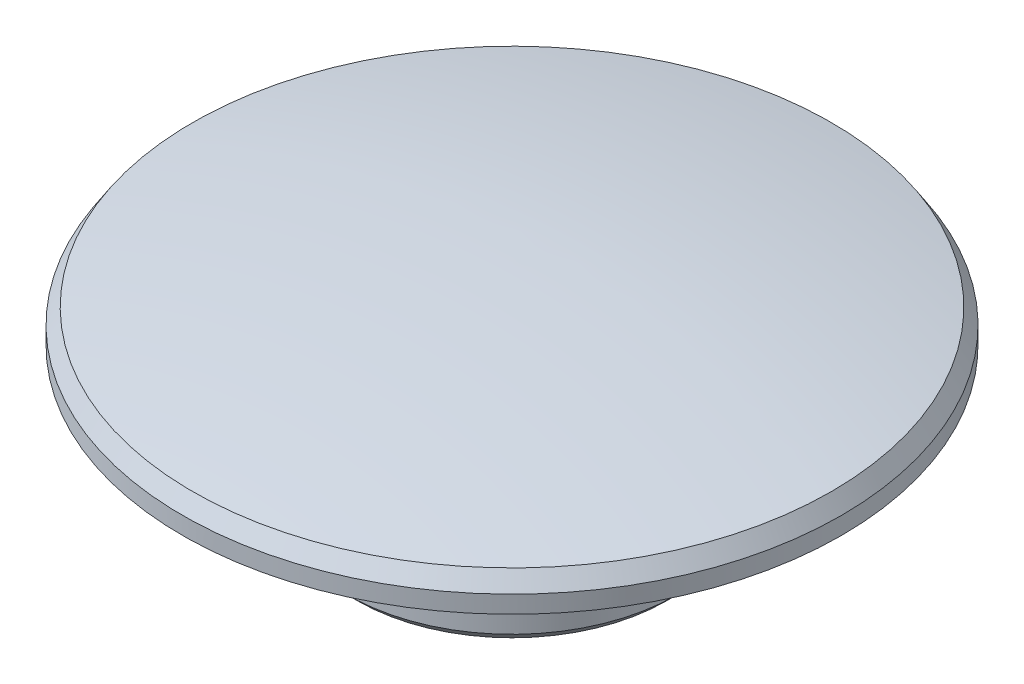
ISO-10303-21;
HEADER;
FILE_DESCRIPTION(('STEP AP214'),'2;1');
FILE_NAME('part.step','',(''),(''),'','','');
FILE_SCHEMA(('AUTOMOTIVE_DESIGN { 1 0 10303 214 1 1 1 1 }'));
ENDSEC;
DATA;
#1=APPLICATION_CONTEXT('core data for automotive mechanical design processes');
#2=APPLICATION_PROTOCOL_DEFINITION('international standard','automotive_design',2000,#1);
#3=PRODUCT_CONTEXT('',#1,'mechanical');
#4=PRODUCT('Part','Part','',(#3));
#5=PRODUCT_RELATED_PRODUCT_CATEGORY('part','',(#4));
#6=PRODUCT_DEFINITION_FORMATION('','',#4);
#7=PRODUCT_DEFINITION_CONTEXT('part definition',#1,'design');
#8=PRODUCT_DEFINITION('design','',#6,#7);
#9=PRODUCT_DEFINITION_SHAPE('','',#8);
#10=(LENGTH_UNIT() NAMED_UNIT(*) SI_UNIT(.MILLI.,.METRE.));
#11=(NAMED_UNIT(*) PLANE_ANGLE_UNIT() SI_UNIT($,.RADIAN.));
#12=(NAMED_UNIT(*) SI_UNIT($,.STERADIAN.) SOLID_ANGLE_UNIT());
#13=UNCERTAINTY_MEASURE_WITH_UNIT(LENGTH_MEASURE(1.E-05),#10,'distance_accuracy_value','');
#14=(GEOMETRIC_REPRESENTATION_CONTEXT(3) GLOBAL_UNCERTAINTY_ASSIGNED_CONTEXT((#13)) GLOBAL_UNIT_ASSIGNED_CONTEXT((#10,
#11,#12)) REPRESENTATION_CONTEXT('',''));
#15=CARTESIAN_POINT('',(0.,0.,0.));
#16=DIRECTION('',(0.,0.,1.));
#17=DIRECTION('',(1.,0.,0.));
#18=AXIS2_PLACEMENT_3D('',#15,#16,#17);
#19=CARTESIAN_POINT('',(5.7,0.,0.));
#20=DIRECTION('',(0.,-1.,0.));
#21=DIRECTION('',(1.,0.,0.));
#22=AXIS2_PLACEMENT_3D('',#19,#20,#21);
#23=PLANE('',#22);
#24=CARTESIAN_POINT('',(0.,0.,0.));
#25=DIRECTION('',(0.,-1.,0.));
#26=DIRECTION('',(1.,0.,0.));
#27=AXIS2_PLACEMENT_3D('',#24,#25,#26);
#28=CIRCLE('',#27,6.19999999999999);
#29=CARTESIAN_POINT('',(6.19999999999999,0.,0.));
#30=VERTEX_POINT('',#29);
#31=EDGE_CURVE('E47',#30,#30,#28,.F.);
#32=ORIENTED_EDGE('',*,*,#31,.T.);
#33=EDGE_LOOP('',(#32));
#34=FACE_BOUND('',#33,.T.);
#35=CARTESIAN_POINT('',(0.,0.,0.));
#36=DIRECTION('',(0.,-1.,0.));
#37=DIRECTION('',(1.,0.,0.));
#38=AXIS2_PLACEMENT_3D('',#35,#36,#37);
#39=CIRCLE('',#38,7.5);
#40=CARTESIAN_POINT('',(7.5,0.,0.));
#41=VERTEX_POINT('',#40);
#42=EDGE_CURVE('E51',#41,#41,#39,.T.);
#43=ORIENTED_EDGE('',*,*,#42,.T.);
#44=EDGE_LOOP('',(#43));
#45=FACE_BOUND('',#44,.T.);
#46=ADVANCED_FACE('F40',(#34,#45),#23,.T.);
#47=CARTESIAN_POINT('',(0.,8.,0.));
#48=DIRECTION('',(0.,-1.,0.));
#49=DIRECTION('',(1.,0.,0.));
#50=AXIS2_PLACEMENT_3D('',#47,#48,#49);
#51=CYLINDRICAL_SURFACE('',#50,5.7);
#52=CARTESIAN_POINT('',(0.,0.499999999999989,0.));
#53=DIRECTION('',(0.,-1.,0.));
#54=DIRECTION('',(1.,0.,0.));
#55=AXIS2_PLACEMENT_3D('',#52,#53,#54);
#56=CIRCLE('',#55,5.7);
#57=CARTESIAN_POINT('',(5.7,0.499999999999989,0.));
#58=VERTEX_POINT('',#57);
#59=EDGE_CURVE('E55',#58,#58,#56,.T.);
#60=ORIENTED_EDGE('',*,*,#59,.T.);
#61=EDGE_LOOP('',(#60));
#62=FACE_BOUND('',#61,.T.);
#63=CARTESIAN_POINT('',(0.,8.,0.));
#64=DIRECTION('',(0.,-1.,0.));
#65=DIRECTION('',(1.,0.,0.));
#66=AXIS2_PLACEMENT_3D('',#63,#64,#65);
#67=CIRCLE('',#66,5.7);
#68=CARTESIAN_POINT('',(5.7,8.,0.));
#69=VERTEX_POINT('',#68);
#70=EDGE_CURVE('E66',#69,#69,#67,.T.);
#71=ORIENTED_EDGE('',*,*,#70,.F.);
#72=EDGE_LOOP('',(#71));
#73=FACE_BOUND('',#72,.T.);
#74=ADVANCED_FACE('F93',(#62,#73),#51,.F.);
#75=CARTESIAN_POINT('',(5.7,8.,0.));
#76=DIRECTION('',(0.,-1.,0.));
#77=DIRECTION('',(1.,0.,0.));
#78=AXIS2_PLACEMENT_3D('',#75,#76,#77);
#79=PLANE('',#78);
#80=ORIENTED_EDGE('',*,*,#70,.T.);
#81=EDGE_LOOP('',(#80));
#82=FACE_BOUND('',#81,.T.);
#83=ADVANCED_FACE('F98',(#82),#79,.T.);
#84=CARTESIAN_POINT('',(0.,-64.6234393063583,0.));
#85=DIRECTION('',(0.,-1.,0.));
#86=DIRECTION('',(1.,0.,0.));
#87=AXIS2_PLACEMENT_3D('',#84,#85,#86);
#88=SPHERICAL_SURFACE('',#87,74.8534393063583);
#89=CARTESIAN_POINT('',(0.,8.60490038217525,0.));
#90=DIRECTION('',(0.,-1.,0.));
#91=DIRECTION('',(1.,0.,0.));
#92=AXIS2_PLACEMENT_3D('',#89,#90,#91);
#93=CIRCLE('',#92,15.5128218726128);
#94=CARTESIAN_POINT('',(15.5128218726128,8.60490038217525,0.));
#95=VERTEX_POINT('',#94);
#96=EDGE_CURVE('E60',#95,#95,#93,.F.);
#97=ORIENTED_EDGE('',*,*,#96,.T.);
#98=EDGE_LOOP('',(#97));
#99=FACE_BOUND('',#98,.T.);
#100=ADVANCED_FACE('F89',(#99),#88,.T.);
#101=CARTESIAN_POINT('',(0.,8.,0.));
#102=DIRECTION('',(0.,-1.,0.));
#103=DIRECTION('',(1.,0.,0.));
#104=AXIS2_PLACEMENT_3D('',#101,#102,#103);
#105=CYLINDRICAL_SURFACE('',#104,16.);
#106=CARTESIAN_POINT('',(0.,7.84480976447417,0.));
#107=DIRECTION('',(0.,1.,0.));
#108=DIRECTION('',(-1.,0.,0.));
#109=AXIS2_PLACEMENT_3D('',#106,#107,#108);
#110=CIRCLE('',#109,16.);
#111=CARTESIAN_POINT('',(-16.,7.84480976447417,0.));
#112=VERTEX_POINT('',#111);
#113=EDGE_CURVE('E63',#112,#112,#110,.F.);
#114=ORIENTED_EDGE('',*,*,#113,.T.);
#115=EDGE_LOOP('',(#114));
#116=FACE_BOUND('',#115,.T.);
#117=CARTESIAN_POINT('',(0.,7.,0.));
#118=DIRECTION('',(0.,-1.,0.));
#119=DIRECTION('',(1.,0.,0.));
#120=AXIS2_PLACEMENT_3D('',#117,#118,#119);
#121=CIRCLE('',#120,16.);
#122=CARTESIAN_POINT('',(16.,7.,0.));
#123=VERTEX_POINT('',#122);
#124=EDGE_CURVE('E69',#123,#123,#121,.T.);
#125=ORIENTED_EDGE('',*,*,#124,.F.);
#126=EDGE_LOOP('',(#125));
#127=FACE_BOUND('',#126,.T.);
#128=ADVANCED_FACE('F80',(#116,#127),#105,.T.);
#129=CARTESIAN_POINT('',(8.,7.,0.));
#130=DIRECTION('',(0.,-1.,0.));
#131=DIRECTION('',(1.,0.,0.));
#132=AXIS2_PLACEMENT_3D('',#129,#130,#131);
#133=PLANE('',#132);
#134=ORIENTED_EDGE('',*,*,#124,.T.);
#135=EDGE_LOOP('',(#134));
#136=FACE_BOUND('',#135,.T.);
#137=CARTESIAN_POINT('',(0.,7.,0.));
#138=DIRECTION('',(0.,-1.,0.));
#139=DIRECTION('',(1.,0.,0.));
#140=AXIS2_PLACEMENT_3D('',#137,#138,#139);
#141=CIRCLE('',#140,8.);
#142=CARTESIAN_POINT('',(8.,7.,0.));
#143=VERTEX_POINT('',#142);
#144=EDGE_CURVE('E72',#143,#143,#141,.T.);
#145=ORIENTED_EDGE('',*,*,#144,.F.);
#146=EDGE_LOOP('',(#145));
#147=FACE_BOUND('',#146,.T.);
#148=ADVANCED_FACE('F78',(#136,#147),#133,.T.);
#149=CARTESIAN_POINT('',(0.,8.,0.));
#150=DIRECTION('',(0.,-1.,0.));
#151=DIRECTION('',(1.,0.,0.));
#152=AXIS2_PLACEMENT_3D('',#149,#150,#151);
#153=CYLINDRICAL_SURFACE('',#152,8.);
#154=CARTESIAN_POINT('',(0.,0.499999999999994,0.));
#155=DIRECTION('',(0.,-1.,0.));
#156=DIRECTION('',(1.,0.,0.));
#157=AXIS2_PLACEMENT_3D('',#154,#155,#156);
#158=CIRCLE('',#157,8.);
#159=CARTESIAN_POINT('',(8.,0.499999999999994,0.));
#160=VERTEX_POINT('',#159);
#161=EDGE_CURVE('E10',#160,#160,#158,.F.);
#162=ORIENTED_EDGE('',*,*,#161,.T.);
#163=EDGE_LOOP('',(#162));
#164=FACE_BOUND('',#163,.T.);
#165=ORIENTED_EDGE('',*,*,#144,.T.);
#166=EDGE_LOOP('',(#165));
#167=FACE_BOUND('',#166,.T.);
#168=ADVANCED_FACE('F76',(#164,#167),#153,.T.);
#169=CARTESIAN_POINT('',(0.,7.84480976447417,0.));
#170=DIRECTION('',(0.,-1.,0.));
#171=DIRECTION('',(1.,0.,0.));
#172=AXIS2_PLACEMENT_3D('',#169,#170,#171);
#173=CONICAL_SURFACE('',#172,16.,0.569985028290283);
#174=ORIENTED_EDGE('',*,*,#96,.F.);
#175=EDGE_LOOP('',(#174));
#176=FACE_BOUND('',#175,.T.);
#177=ORIENTED_EDGE('',*,*,#113,.F.);
#178=EDGE_LOOP('',(#177));
#179=FACE_BOUND('',#178,.T.);
#180=ADVANCED_FACE('F87',(#176,#179),#173,.T.);
#181=CARTESIAN_POINT('',(0.,0.499999999999989,0.));
#182=DIRECTION('',(0.,-1.,0.));
#183=DIRECTION('',(1.,0.,0.));
#184=AXIS2_PLACEMENT_3D('',#181,#182,#183);
#185=CONICAL_SURFACE('',#184,5.7,0.78539816339745);
#186=ORIENTED_EDGE('',*,*,#31,.F.);
#187=EDGE_LOOP('',(#186));
#188=FACE_BOUND('',#187,.T.);
#189=ORIENTED_EDGE('',*,*,#59,.F.);
#190=EDGE_LOOP('',(#189));
#191=FACE_BOUND('',#190,.T.);
#192=ADVANCED_FACE('F105',(#188,#191),#185,.F.);
#193=CARTESIAN_POINT('',(0.,0.,0.));
#194=DIRECTION('',(0.,1.,0.));
#195=DIRECTION('',(-1.,0.,0.));
#196=AXIS2_PLACEMENT_3D('',#193,#194,#195);
#197=CONICAL_SURFACE('',#196,7.5,0.785398163397455);
#198=ORIENTED_EDGE('',*,*,#161,.F.);
#199=EDGE_LOOP('',(#198));
#200=FACE_BOUND('',#199,.T.);
#201=ORIENTED_EDGE('',*,*,#42,.F.);
#202=EDGE_LOOP('',(#201));
#203=FACE_BOUND('',#202,.T.);
#204=ADVANCED_FACE('F42',(#200,#203),#197,.T.);
#205=CLOSED_SHELL('',(#46,#74,#83,#100,#128,#148,#168,#180,#192,#204));
#206=MANIFOLD_SOLID_BREP('B2',#205);
#207=ADVANCED_BREP_SHAPE_REPRESENTATION('',(#18,#206),#14);
#208=SHAPE_DEFINITION_REPRESENTATION(#9,#207);
ENDSEC;
END-ISO-10303-21;
